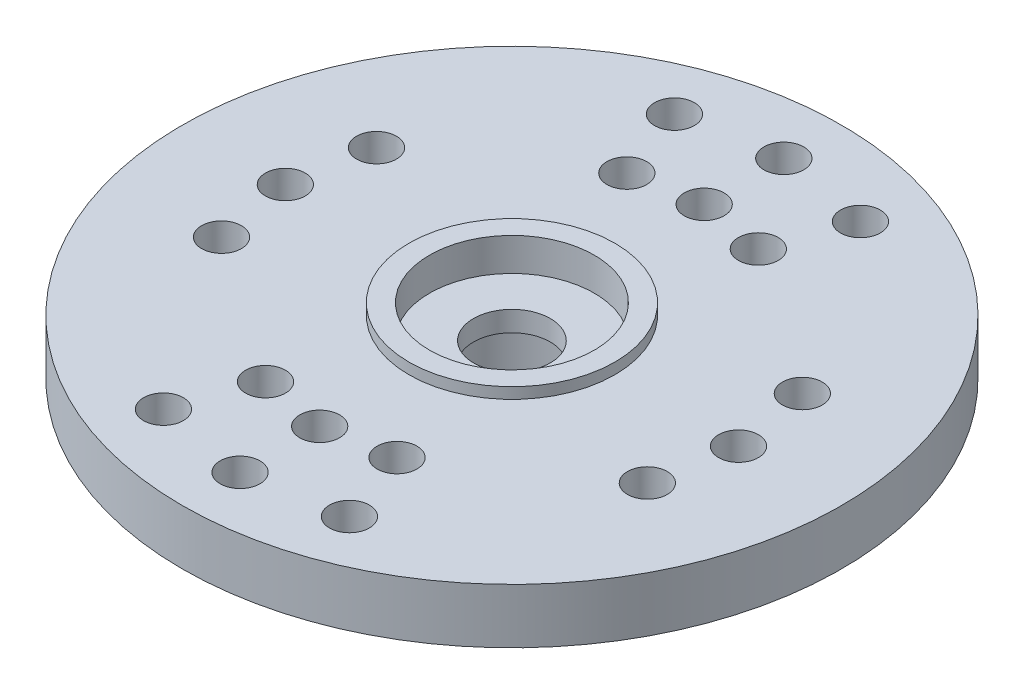
ISO-10303-21;
HEADER;
FILE_DESCRIPTION(('STEP AP214'),'2;1');
FILE_NAME('part.step','',(''),(''),'','','');
FILE_SCHEMA(('AUTOMOTIVE_DESIGN { 1 0 10303 214 1 1 1 1 }'));
ENDSEC;
DATA;
#1=APPLICATION_CONTEXT('core data for automotive mechanical design processes');
#2=APPLICATION_PROTOCOL_DEFINITION('international standard','automotive_design',2000,#1);
#3=PRODUCT_CONTEXT('',#1,'mechanical');
#4=PRODUCT('Part','Part','',(#3));
#5=PRODUCT_RELATED_PRODUCT_CATEGORY('part','',(#4));
#6=PRODUCT_DEFINITION_FORMATION('','',#4);
#7=PRODUCT_DEFINITION_CONTEXT('part definition',#1,'design');
#8=PRODUCT_DEFINITION('design','',#6,#7);
#9=PRODUCT_DEFINITION_SHAPE('','',#8);
#10=(LENGTH_UNIT() NAMED_UNIT(*) SI_UNIT(.MILLI.,.METRE.));
#11=(NAMED_UNIT(*) PLANE_ANGLE_UNIT() SI_UNIT($,.RADIAN.));
#12=(NAMED_UNIT(*) SI_UNIT($,.STERADIAN.) SOLID_ANGLE_UNIT());
#13=UNCERTAINTY_MEASURE_WITH_UNIT(LENGTH_MEASURE(1.E-05),#10,'distance_accuracy_value','');
#14=(GEOMETRIC_REPRESENTATION_CONTEXT(3) GLOBAL_UNCERTAINTY_ASSIGNED_CONTEXT((#13)) GLOBAL_UNIT_ASSIGNED_CONTEXT((#10,
#11,#12)) REPRESENTATION_CONTEXT('',''));
#15=CARTESIAN_POINT('',(0.,0.,0.));
#16=DIRECTION('',(0.,0.,1.));
#17=DIRECTION('',(1.,0.,0.));
#18=AXIS2_PLACEMENT_3D('',#15,#16,#17);
#19=CARTESIAN_POINT('',(0.,0.,0.));
#20=DIRECTION('',(0.,1.,0.));
#21=DIRECTION('',(0.,0.,1.));
#22=AXIS2_PLACEMENT_3D('',#19,#20,#21);
#23=CYLINDRICAL_SURFACE('',#22,3.75);
#24=CARTESIAN_POINT('',(0.,0.,0.));
#25=DIRECTION('',(0.,1.,0.));
#26=DIRECTION('',(0.,0.,1.));
#27=AXIS2_PLACEMENT_3D('',#24,#25,#26);
#28=CIRCLE('',#27,3.75);
#29=CARTESIAN_POINT('',(0.,0.,3.75));
#30=VERTEX_POINT('',#29);
#31=EDGE_CURVE('E88',#30,#30,#28,.T.);
#32=ORIENTED_EDGE('',*,*,#31,.T.);
#33=EDGE_LOOP('',(#32));
#34=FACE_BOUND('',#33,.T.);
#35=CARTESIAN_POINT('',(0.,0.4,0.));
#36=DIRECTION('',(0.,1.,0.));
#37=DIRECTION('',(0.,0.,1.));
#38=AXIS2_PLACEMENT_3D('',#35,#36,#37);
#39=CIRCLE('',#38,3.75);
#40=CARTESIAN_POINT('',(0.,0.4,3.75));
#41=VERTEX_POINT('',#40);
#42=EDGE_CURVE('E10',#41,#41,#39,.T.);
#43=ORIENTED_EDGE('',*,*,#42,.F.);
#44=EDGE_LOOP('',(#43));
#45=FACE_BOUND('',#44,.T.);
#46=ADVANCED_FACE('F37',(#34,#45),#23,.T.);
#47=CARTESIAN_POINT('',(-3.75,0.4,0.));
#48=DIRECTION('',(0.,1.,0.));
#49=DIRECTION('',(0.,0.,1.));
#50=AXIS2_PLACEMENT_3D('',#47,#48,#49);
#51=PLANE('',#50);
#52=ORIENTED_EDGE('',*,*,#42,.T.);
#53=EDGE_LOOP('',(#52));
#54=FACE_BOUND('',#53,.T.);
#55=CARTESIAN_POINT('',(0.,0.4,0.));
#56=DIRECTION('',(0.,1.,0.));
#57=DIRECTION('',(0.,0.,1.));
#58=AXIS2_PLACEMENT_3D('',#55,#56,#57);
#59=CIRCLE('',#58,3.);
#60=CARTESIAN_POINT('',(0.,0.4,3.));
#61=VERTEX_POINT('',#60);
#62=EDGE_CURVE('E44',#61,#61,#59,.T.);
#63=ORIENTED_EDGE('',*,*,#62,.F.);
#64=EDGE_LOOP('',(#63));
#65=FACE_BOUND('',#64,.T.);
#66=ADVANCED_FACE('F254',(#54,#65),#51,.T.);
#67=CARTESIAN_POINT('',(0.,0.,0.));
#68=DIRECTION('',(0.,1.,0.));
#69=DIRECTION('',(0.,0.,1.));
#70=AXIS2_PLACEMENT_3D('',#67,#68,#69);
#71=CYLINDRICAL_SURFACE('',#70,3.);
#72=ORIENTED_EDGE('',*,*,#62,.T.);
#73=EDGE_LOOP('',(#72));
#74=FACE_BOUND('',#73,.T.);
#75=CARTESIAN_POINT('',(0.,-0.8,0.));
#76=DIRECTION('',(0.,1.,0.));
#77=DIRECTION('',(0.,0.,1.));
#78=AXIS2_PLACEMENT_3D('',#75,#76,#77);
#79=CIRCLE('',#78,3.);
#80=CARTESIAN_POINT('',(0.,-0.8,3.));
#81=VERTEX_POINT('',#80);
#82=EDGE_CURVE('E49',#81,#81,#79,.T.);
#83=ORIENTED_EDGE('',*,*,#82,.F.);
#84=EDGE_LOOP('',(#83));
#85=FACE_BOUND('',#84,.T.);
#86=ADVANCED_FACE('F258',(#74,#85),#71,.F.);
#87=CARTESIAN_POINT('',(-3.,-0.8,0.));
#88=DIRECTION('',(0.,1.,0.));
#89=DIRECTION('',(0.,0.,1.));
#90=AXIS2_PLACEMENT_3D('',#87,#88,#89);
#91=PLANE('',#90);
#92=ORIENTED_EDGE('',*,*,#82,.T.);
#93=EDGE_LOOP('',(#92));
#94=FACE_BOUND('',#93,.T.);
#95=CARTESIAN_POINT('',(0.,-0.8,0.));
#96=DIRECTION('',(0.,1.,0.));
#97=DIRECTION('',(0.,0.,1.));
#98=AXIS2_PLACEMENT_3D('',#95,#96,#97);
#99=CIRCLE('',#98,1.4);
#100=CARTESIAN_POINT('',(0.,-0.8,1.4));
#101=VERTEX_POINT('',#100);
#102=EDGE_CURVE('E54',#101,#101,#99,.T.);
#103=ORIENTED_EDGE('',*,*,#102,.F.);
#104=EDGE_LOOP('',(#103));
#105=FACE_BOUND('',#104,.T.);
#106=ADVANCED_FACE('F262',(#94,#105),#91,.T.);
#107=CARTESIAN_POINT('',(0.,0.,0.));
#108=DIRECTION('',(0.,1.,0.));
#109=DIRECTION('',(0.,0.,1.));
#110=AXIS2_PLACEMENT_3D('',#107,#108,#109);
#111=CYLINDRICAL_SURFACE('',#110,1.4);
#112=ORIENTED_EDGE('',*,*,#102,.T.);
#113=EDGE_LOOP('',(#112));
#114=FACE_BOUND('',#113,.T.);
#115=CARTESIAN_POINT('',(0.,-1.54,0.));
#116=DIRECTION('',(0.,1.,0.));
#117=DIRECTION('',(0.,0.,1.));
#118=AXIS2_PLACEMENT_3D('',#115,#116,#117);
#119=CIRCLE('',#118,1.4);
#120=CARTESIAN_POINT('',(0.,-1.54,1.4));
#121=VERTEX_POINT('',#120);
#122=EDGE_CURVE('E60',#121,#121,#119,.T.);
#123=ORIENTED_EDGE('',*,*,#122,.F.);
#124=EDGE_LOOP('',(#123));
#125=FACE_BOUND('',#124,.T.);
#126=ADVANCED_FACE('F268',(#114,#125),#111,.F.);
#127=CARTESIAN_POINT('',(-1.4,-1.54,0.));
#128=DIRECTION('',(0.,-1.,0.));
#129=DIRECTION('',(0.,0.,-1.));
#130=AXIS2_PLACEMENT_3D('',#127,#128,#129);
#131=PLANE('',#130);
#132=ORIENTED_EDGE('',*,*,#122,.T.);
#133=EDGE_LOOP('',(#132));
#134=FACE_BOUND('',#133,.T.);
#135=CARTESIAN_POINT('',(0.,-1.54,0.));
#136=DIRECTION('',(0.,1.,0.));
#137=DIRECTION('',(0.,0.,1.));
#138=AXIS2_PLACEMENT_3D('',#135,#136,#137);
#139=CIRCLE('',#138,2.65);
#140=CARTESIAN_POINT('',(0.,-1.54,2.65));
#141=VERTEX_POINT('',#140);
#142=EDGE_CURVE('E64',#141,#141,#139,.T.);
#143=ORIENTED_EDGE('',*,*,#142,.F.);
#144=EDGE_LOOP('',(#143));
#145=FACE_BOUND('',#144,.T.);
#146=ADVANCED_FACE('F272',(#134,#145),#131,.T.);
#147=CARTESIAN_POINT('',(0.,0.,0.));
#148=DIRECTION('',(0.,1.,0.));
#149=DIRECTION('',(0.,0.,1.));
#150=AXIS2_PLACEMENT_3D('',#147,#148,#149);
#151=CYLINDRICAL_SURFACE('',#150,2.65);
#152=ORIENTED_EDGE('',*,*,#142,.T.);
#153=EDGE_LOOP('',(#152));
#154=FACE_BOUND('',#153,.T.);
#155=CARTESIAN_POINT('',(0.,-4.54,0.));
#156=DIRECTION('',(0.,1.,0.));
#157=DIRECTION('',(0.,0.,1.));
#158=AXIS2_PLACEMENT_3D('',#155,#156,#157);
#159=CIRCLE('',#158,2.65);
#160=CARTESIAN_POINT('',(0.,-4.54,2.65));
#161=VERTEX_POINT('',#160);
#162=EDGE_CURVE('E68',#161,#161,#159,.T.);
#163=ORIENTED_EDGE('',*,*,#162,.F.);
#164=EDGE_LOOP('',(#163));
#165=FACE_BOUND('',#164,.T.);
#166=ADVANCED_FACE('F276',(#154,#165),#151,.F.);
#167=CARTESIAN_POINT('',(-2.65,-4.54,0.));
#168=DIRECTION('',(0.,-1.,0.));
#169=DIRECTION('',(0.,0.,-1.));
#170=AXIS2_PLACEMENT_3D('',#167,#168,#169);
#171=PLANE('',#170);
#172=ORIENTED_EDGE('',*,*,#162,.T.);
#173=EDGE_LOOP('',(#172));
#174=FACE_BOUND('',#173,.T.);
#175=CARTESIAN_POINT('',(0.,-4.54,0.));
#176=DIRECTION('',(0.,1.,0.));
#177=DIRECTION('',(0.,0.,1.));
#178=AXIS2_PLACEMENT_3D('',#175,#176,#177);
#179=CIRCLE('',#178,4.44);
#180=CARTESIAN_POINT('',(0.,-4.54,4.44));
#181=VERTEX_POINT('',#180);
#182=EDGE_CURVE('E72',#181,#181,#179,.T.);
#183=ORIENTED_EDGE('',*,*,#182,.F.);
#184=EDGE_LOOP('',(#183));
#185=FACE_BOUND('',#184,.T.);
#186=ADVANCED_FACE('F280',(#174,#185),#171,.T.);
#187=CARTESIAN_POINT('',(0.,0.,0.));
#188=DIRECTION('',(0.,1.,0.));
#189=DIRECTION('',(0.,0.,1.));
#190=AXIS2_PLACEMENT_3D('',#187,#188,#189);
#191=CYLINDRICAL_SURFACE('',#190,4.44);
#192=ORIENTED_EDGE('',*,*,#182,.T.);
#193=EDGE_LOOP('',(#192));
#194=FACE_BOUND('',#193,.T.);
#195=CARTESIAN_POINT('',(0.,-2.,0.));
#196=DIRECTION('',(0.,1.,0.));
#197=DIRECTION('',(0.,0.,1.));
#198=AXIS2_PLACEMENT_3D('',#195,#196,#197);
#199=CIRCLE('',#198,4.44);
#200=CARTESIAN_POINT('',(0.,-2.,4.44));
#201=VERTEX_POINT('',#200);
#202=EDGE_CURVE('E76',#201,#201,#199,.T.);
#203=ORIENTED_EDGE('',*,*,#202,.F.);
#204=EDGE_LOOP('',(#203));
#205=FACE_BOUND('',#204,.T.);
#206=ADVANCED_FACE('F284',(#194,#205),#191,.T.);
#207=CARTESIAN_POINT('',(-4.44,-2.,0.));
#208=DIRECTION('',(0.,-1.,0.));
#209=DIRECTION('',(0.,0.,-1.));
#210=AXIS2_PLACEMENT_3D('',#207,#208,#209);
#211=PLANE('',#210);
#212=CARTESIAN_POINT('',(0.,-2.,9.9));
#213=DIRECTION('',(0.,-1.,0.));
#214=DIRECTION('',(0.,0.,-1.));
#215=AXIS2_PLACEMENT_3D('',#212,#213,#214);
#216=CIRCLE('',#215,0.725);
#217=CARTESIAN_POINT('',(0.,-2.,9.175));
#218=VERTEX_POINT('',#217);
#219=EDGE_CURVE('E92',#218,#218,#216,.T.);
#220=ORIENTED_EDGE('',*,*,#219,.F.);
#221=EDGE_LOOP('',(#220));
#222=FACE_BOUND('',#221,.T.);
#223=CARTESIAN_POINT('',(7.75246412148376,-2.,2.82166618243672));
#224=DIRECTION('',(0.,-1.,0.));
#225=DIRECTION('',(0.,0.,-1.));
#226=AXIS2_PLACEMENT_3D('',#223,#224,#225);
#227=CIRCLE('',#226,0.725000000000001);
#228=CARTESIAN_POINT('',(7.75246412148376,-2.,2.09666618243672));
#229=VERTEX_POINT('',#228);
#230=EDGE_CURVE('E96',#229,#229,#227,.T.);
#231=ORIENTED_EDGE('',*,*,#230,.F.);
#232=EDGE_LOOP('',(#231));
#233=FACE_BOUND('',#232,.T.);
#234=CARTESIAN_POINT('',(0.,-2.,7.));
#235=DIRECTION('',(0.,-1.,0.));
#236=DIRECTION('',(0.,0.,-1.));
#237=AXIS2_PLACEMENT_3D('',#234,#235,#236);
#238=CIRCLE('',#237,0.725);
#239=CARTESIAN_POINT('',(0.,-2.,6.275));
#240=VERTEX_POINT('',#239);
#241=EDGE_CURVE('E100',#240,#240,#238,.T.);
#242=ORIENTED_EDGE('',*,*,#241,.F.);
#243=EDGE_LOOP('',(#242));
#244=FACE_BOUND('',#243,.T.);
#245=CARTESIAN_POINT('',(8.25,-2.,0.));
#246=DIRECTION('',(0.,-1.,0.));
#247=DIRECTION('',(0.,0.,-1.));
#248=AXIS2_PLACEMENT_3D('',#245,#246,#247);
#249=CIRCLE('',#248,0.725);
#250=CARTESIAN_POINT('',(8.25,-2.,-0.725));
#251=VERTEX_POINT('',#250);
#252=EDGE_CURVE('E104',#251,#251,#249,.T.);
#253=ORIENTED_EDGE('',*,*,#252,.F.);
#254=EDGE_LOOP('',(#253));
#255=FACE_BOUND('',#254,.T.);
#256=CARTESIAN_POINT('',(-2.39414100327969,-2.,6.57784834550135));
#257=DIRECTION('',(0.,-1.,0.));
#258=DIRECTION('',(0.,0.,-1.));
#259=AXIS2_PLACEMENT_3D('',#256,#257,#258);
#260=CIRCLE('',#259,0.725);
#261=CARTESIAN_POINT('',(-2.39414100327969,-2.,5.85284834550135));
#262=VERTEX_POINT('',#261);
#263=EDGE_CURVE('E108',#262,#262,#260,.T.);
#264=ORIENTED_EDGE('',*,*,#263,.F.);
#265=EDGE_LOOP('',(#264));
#266=FACE_BOUND('',#265,.T.);
#267=CARTESIAN_POINT('',(-3.38599941892414,-2.,9.30295694578049));
#268=DIRECTION('',(0.,-1.,0.));
#269=DIRECTION('',(0.,0.,-1.));
#270=AXIS2_PLACEMENT_3D('',#267,#268,#269);
#271=CIRCLE('',#270,0.725);
#272=CARTESIAN_POINT('',(-3.38599941892414,-2.,8.57795694578049));
#273=VERTEX_POINT('',#272);
#274=EDGE_CURVE('E112',#273,#273,#271,.T.);
#275=ORIENTED_EDGE('',*,*,#274,.F.);
#276=EDGE_LOOP('',(#275));
#277=FACE_BOUND('',#276,.T.);
#278=CARTESIAN_POINT('',(2.39414100327968,-2.,6.57784834550136));
#279=DIRECTION('',(0.,-1.,0.));
#280=DIRECTION('',(0.,0.,-1.));
#281=AXIS2_PLACEMENT_3D('',#278,#279,#280);
#282=CIRCLE('',#281,0.725);
#283=CARTESIAN_POINT('',(2.39414100327968,-2.,5.85284834550136));
#284=VERTEX_POINT('',#283);
#285=EDGE_CURVE('E116',#284,#284,#282,.T.);
#286=ORIENTED_EDGE('',*,*,#285,.F.);
#287=EDGE_LOOP('',(#286));
#288=FACE_BOUND('',#287,.T.);
#289=CARTESIAN_POINT('',(3.38599941892412,-2.,9.3029569457805));
#290=DIRECTION('',(0.,-1.,0.));
#291=DIRECTION('',(0.,0.,-1.));
#292=AXIS2_PLACEMENT_3D('',#289,#290,#291);
#293=CIRCLE('',#292,0.724999999999999);
#294=CARTESIAN_POINT('',(3.38599941892412,-2.,8.5779569457805));
#295=VERTEX_POINT('',#294);
#296=EDGE_CURVE('E120',#295,#295,#293,.T.);
#297=ORIENTED_EDGE('',*,*,#296,.F.);
#298=EDGE_LOOP('',(#297));
#299=FACE_BOUND('',#298,.T.);
#300=CARTESIAN_POINT('',(2.39414100327969,-2.,-6.57784834550136));
#301=DIRECTION('',(0.,-1.,0.));
#302=DIRECTION('',(0.,0.,-1.));
#303=AXIS2_PLACEMENT_3D('',#300,#301,#302);
#304=CIRCLE('',#303,0.725);
#305=CARTESIAN_POINT('',(2.39414100327969,-2.,-7.30284834550136));
#306=VERTEX_POINT('',#305);
#307=EDGE_CURVE('E124',#306,#306,#304,.T.);
#308=ORIENTED_EDGE('',*,*,#307,.F.);
#309=EDGE_LOOP('',(#308));
#310=FACE_BOUND('',#309,.T.);
#311=CARTESIAN_POINT('',(0.,-2.,-9.9));
#312=DIRECTION('',(0.,-1.,0.));
#313=DIRECTION('',(0.,0.,-1.));
#314=AXIS2_PLACEMENT_3D('',#311,#312,#313);
#315=CIRCLE('',#314,0.725);
#316=CARTESIAN_POINT('',(0.,-2.,-10.625));
#317=VERTEX_POINT('',#316);
#318=EDGE_CURVE('E128',#317,#317,#315,.T.);
#319=ORIENTED_EDGE('',*,*,#318,.F.);
#320=EDGE_LOOP('',(#319));
#321=FACE_BOUND('',#320,.T.);
#322=CARTESIAN_POINT('',(-7.75246412148376,-2.,-2.82166618243672));
#323=DIRECTION('',(0.,-1.,0.));
#324=DIRECTION('',(0.,0.,-1.));
#325=AXIS2_PLACEMENT_3D('',#322,#323,#324);
#326=CIRCLE('',#325,0.725);
#327=CARTESIAN_POINT('',(-7.75246412148376,-2.,-3.54666618243672));
#328=VERTEX_POINT('',#327);
#329=EDGE_CURVE('E132',#328,#328,#326,.T.);
#330=ORIENTED_EDGE('',*,*,#329,.F.);
#331=EDGE_LOOP('',(#330));
#332=FACE_BOUND('',#331,.T.);
#333=CARTESIAN_POINT('',(0.,-2.,-7.));
#334=DIRECTION('',(0.,-1.,0.));
#335=DIRECTION('',(0.,0.,-1.));
#336=AXIS2_PLACEMENT_3D('',#333,#334,#335);
#337=CIRCLE('',#336,0.725);
#338=CARTESIAN_POINT('',(0.,-2.,-7.725));
#339=VERTEX_POINT('',#338);
#340=EDGE_CURVE('E136',#339,#339,#337,.T.);
#341=ORIENTED_EDGE('',*,*,#340,.F.);
#342=EDGE_LOOP('',(#341));
#343=FACE_BOUND('',#342,.T.);
#344=CARTESIAN_POINT('',(-7.75246412148376,-2.,2.82166618243672));
#345=DIRECTION('',(0.,-1.,0.));
#346=DIRECTION('',(0.,0.,-1.));
#347=AXIS2_PLACEMENT_3D('',#344,#345,#346);
#348=CIRCLE('',#347,0.725);
#349=CARTESIAN_POINT('',(-7.75246412148376,-2.,2.09666618243672));
#350=VERTEX_POINT('',#349);
#351=EDGE_CURVE('E140',#350,#350,#348,.T.);
#352=ORIENTED_EDGE('',*,*,#351,.F.);
#353=EDGE_LOOP('',(#352));
#354=FACE_BOUND('',#353,.T.);
#355=CARTESIAN_POINT('',(-3.38599941892413,-2.,-9.30295694578049));
#356=DIRECTION('',(0.,-1.,0.));
#357=DIRECTION('',(0.,0.,-1.));
#358=AXIS2_PLACEMENT_3D('',#355,#356,#357);
#359=CIRCLE('',#358,0.725);
#360=CARTESIAN_POINT('',(-3.38599941892413,-2.,-10.0279569457805));
#361=VERTEX_POINT('',#360);
#362=EDGE_CURVE('E144',#361,#361,#359,.T.);
#363=ORIENTED_EDGE('',*,*,#362,.F.);
#364=EDGE_LOOP('',(#363));
#365=FACE_BOUND('',#364,.T.);
#366=CARTESIAN_POINT('',(-2.39414100327969,-2.,-6.57784834550136));
#367=DIRECTION('',(0.,-1.,0.));
#368=DIRECTION('',(0.,0.,-1.));
#369=AXIS2_PLACEMENT_3D('',#366,#367,#368);
#370=CIRCLE('',#369,0.725);
#371=CARTESIAN_POINT('',(-2.39414100327969,-2.,-7.30284834550136));
#372=VERTEX_POINT('',#371);
#373=EDGE_CURVE('E148',#372,#372,#370,.T.);
#374=ORIENTED_EDGE('',*,*,#373,.F.);
#375=EDGE_LOOP('',(#374));
#376=FACE_BOUND('',#375,.T.);
#377=CARTESIAN_POINT('',(3.38599941892413,-2.,-9.30295694578049));
#378=DIRECTION('',(0.,-1.,0.));
#379=DIRECTION('',(0.,0.,-1.));
#380=AXIS2_PLACEMENT_3D('',#377,#378,#379);
#381=CIRCLE('',#380,0.725);
#382=CARTESIAN_POINT('',(3.38599941892413,-2.,-10.0279569457805));
#383=VERTEX_POINT('',#382);
#384=EDGE_CURVE('E152',#383,#383,#381,.T.);
#385=ORIENTED_EDGE('',*,*,#384,.F.);
#386=EDGE_LOOP('',(#385));
#387=FACE_BOUND('',#386,.T.);
#388=CARTESIAN_POINT('',(7.75246412148376,-2.,-2.82166618243672));
#389=DIRECTION('',(0.,-1.,0.));
#390=DIRECTION('',(0.,0.,-1.));
#391=AXIS2_PLACEMENT_3D('',#388,#389,#390);
#392=CIRCLE('',#391,0.725000000000001);
#393=CARTESIAN_POINT('',(7.75246412148376,-2.,-3.54666618243672));
#394=VERTEX_POINT('',#393);
#395=EDGE_CURVE('E156',#394,#394,#392,.T.);
#396=ORIENTED_EDGE('',*,*,#395,.F.);
#397=EDGE_LOOP('',(#396));
#398=FACE_BOUND('',#397,.T.);
#399=CARTESIAN_POINT('',(-8.25,-2.,0.));
#400=DIRECTION('',(0.,-1.,0.));
#401=DIRECTION('',(0.,0.,-1.));
#402=AXIS2_PLACEMENT_3D('',#399,#400,#401);
#403=CIRCLE('',#402,0.725);
#404=CARTESIAN_POINT('',(-8.25,-2.,-0.725));
#405=VERTEX_POINT('',#404);
#406=EDGE_CURVE('E160',#405,#405,#403,.T.);
#407=ORIENTED_EDGE('',*,*,#406,.F.);
#408=EDGE_LOOP('',(#407));
#409=FACE_BOUND('',#408,.T.);
#410=ORIENTED_EDGE('',*,*,#202,.T.);
#411=EDGE_LOOP('',(#410));
#412=FACE_BOUND('',#411,.T.);
#413=CARTESIAN_POINT('',(0.,-2.,0.));
#414=DIRECTION('',(0.,1.,0.));
#415=DIRECTION('',(0.,0.,1.));
#416=AXIS2_PLACEMENT_3D('',#413,#414,#415);
#417=CIRCLE('',#416,12.);
#418=CARTESIAN_POINT('',(0.,-2.,12.));
#419=VERTEX_POINT('',#418);
#420=EDGE_CURVE('E80',#419,#419,#417,.T.);
#421=ORIENTED_EDGE('',*,*,#420,.F.);
#422=EDGE_LOOP('',(#421));
#423=FACE_BOUND('',#422,.T.);
#424=ADVANCED_FACE('F288',(#222,#233,#244,#255,#266,#277,#288,#299,#310,#321,#332,#343,#354,
#365,#376,#387,#398,#409,#412,#423),#211,.T.);
#425=CARTESIAN_POINT('',(0.,0.,0.));
#426=DIRECTION('',(0.,1.,0.));
#427=DIRECTION('',(0.,0.,1.));
#428=AXIS2_PLACEMENT_3D('',#425,#426,#427);
#429=CYLINDRICAL_SURFACE('',#428,12.);
#430=ORIENTED_EDGE('',*,*,#420,.T.);
#431=EDGE_LOOP('',(#430));
#432=FACE_BOUND('',#431,.T.);
#433=CARTESIAN_POINT('',(0.,0.,0.));
#434=DIRECTION('',(0.,1.,0.));
#435=DIRECTION('',(0.,0.,1.));
#436=AXIS2_PLACEMENT_3D('',#433,#434,#435);
#437=CIRCLE('',#436,12.);
#438=CARTESIAN_POINT('',(0.,0.,12.));
#439=VERTEX_POINT('',#438);
#440=EDGE_CURVE('E84',#439,#439,#437,.T.);
#441=ORIENTED_EDGE('',*,*,#440,.F.);
#442=EDGE_LOOP('',(#441));
#443=FACE_BOUND('',#442,.T.);
#444=ADVANCED_FACE('F243',(#432,#443),#429,.T.);
#445=CARTESIAN_POINT('',(-3.75,0.,0.));
#446=DIRECTION('',(0.,1.,0.));
#447=DIRECTION('',(0.,0.,1.));
#448=AXIS2_PLACEMENT_3D('',#445,#446,#447);
#449=PLANE('',#448);
#450=CARTESIAN_POINT('',(0.,0.,9.9));
#451=DIRECTION('',(0.,1.,0.));
#452=DIRECTION('',(0.,0.,1.));
#453=AXIS2_PLACEMENT_3D('',#450,#451,#452);
#454=CIRCLE('',#453,0.725);
#455=CARTESIAN_POINT('',(0.,0.,10.625));
#456=VERTEX_POINT('',#455);
#457=EDGE_CURVE('E209',#456,#456,#454,.T.);
#458=ORIENTED_EDGE('',*,*,#457,.F.);
#459=EDGE_LOOP('',(#458));
#460=FACE_BOUND('',#459,.T.);
#461=CARTESIAN_POINT('',(7.75246412148376,0.,2.82166618243672));
#462=DIRECTION('',(0.,1.,0.));
#463=DIRECTION('',(0.,0.,1.));
#464=AXIS2_PLACEMENT_3D('',#461,#462,#463);
#465=CIRCLE('',#464,0.725000000000001);
#466=CARTESIAN_POINT('',(7.75246412148376,0.,3.54666618243672));
#467=VERTEX_POINT('',#466);
#468=EDGE_CURVE('E205',#467,#467,#465,.T.);
#469=ORIENTED_EDGE('',*,*,#468,.F.);
#470=EDGE_LOOP('',(#469));
#471=FACE_BOUND('',#470,.T.);
#472=CARTESIAN_POINT('',(0.,0.,7.));
#473=DIRECTION('',(0.,1.,0.));
#474=DIRECTION('',(0.,0.,1.));
#475=AXIS2_PLACEMENT_3D('',#472,#473,#474);
#476=CIRCLE('',#475,0.725);
#477=CARTESIAN_POINT('',(0.,0.,7.725));
#478=VERTEX_POINT('',#477);
#479=EDGE_CURVE('E201',#478,#478,#476,.T.);
#480=ORIENTED_EDGE('',*,*,#479,.F.);
#481=EDGE_LOOP('',(#480));
#482=FACE_BOUND('',#481,.T.);
#483=CARTESIAN_POINT('',(8.25,0.,0.));
#484=DIRECTION('',(0.,1.,0.));
#485=DIRECTION('',(0.,0.,1.));
#486=AXIS2_PLACEMENT_3D('',#483,#484,#485);
#487=CIRCLE('',#486,0.725);
#488=CARTESIAN_POINT('',(8.25,0.,0.725));
#489=VERTEX_POINT('',#488);
#490=EDGE_CURVE('E197',#489,#489,#487,.T.);
#491=ORIENTED_EDGE('',*,*,#490,.F.);
#492=EDGE_LOOP('',(#491));
#493=FACE_BOUND('',#492,.T.);
#494=CARTESIAN_POINT('',(-2.39414100327969,0.,6.57784834550135));
#495=DIRECTION('',(0.,1.,0.));
#496=DIRECTION('',(0.,0.,1.));
#497=AXIS2_PLACEMENT_3D('',#494,#495,#496);
#498=CIRCLE('',#497,0.725);
#499=CARTESIAN_POINT('',(-2.39414100327969,0.,7.30284834550135));
#500=VERTEX_POINT('',#499);
#501=EDGE_CURVE('E213',#500,#500,#498,.T.);
#502=ORIENTED_EDGE('',*,*,#501,.F.);
#503=EDGE_LOOP('',(#502));
#504=FACE_BOUND('',#503,.T.);
#505=CARTESIAN_POINT('',(-3.38599941892414,0.,9.30295694578049));
#506=DIRECTION('',(0.,1.,0.));
#507=DIRECTION('',(0.,0.,1.));
#508=AXIS2_PLACEMENT_3D('',#505,#506,#507);
#509=CIRCLE('',#508,0.725);
#510=CARTESIAN_POINT('',(-3.38599941892414,0.,10.0279569457805));
#511=VERTEX_POINT('',#510);
#512=EDGE_CURVE('E226',#511,#511,#509,.T.);
#513=ORIENTED_EDGE('',*,*,#512,.F.);
#514=EDGE_LOOP('',(#513));
#515=FACE_BOUND('',#514,.T.);
#516=CARTESIAN_POINT('',(2.39414100327968,0.,6.57784834550136));
#517=DIRECTION('',(0.,1.,0.));
#518=DIRECTION('',(0.,0.,-1.));
#519=AXIS2_PLACEMENT_3D('',#516,#517,#518);
#520=CIRCLE('',#519,0.725);
#521=CARTESIAN_POINT('',(2.39414100327968,0.,5.85284834550136));
#522=VERTEX_POINT('',#521);
#523=EDGE_CURVE('E221',#522,#522,#520,.T.);
#524=ORIENTED_EDGE('',*,*,#523,.F.);
#525=EDGE_LOOP('',(#524));
#526=FACE_BOUND('',#525,.T.);
#527=CARTESIAN_POINT('',(3.38599941892412,0.,9.3029569457805));
#528=DIRECTION('',(0.,1.,0.));
#529=DIRECTION('',(0.,0.,-1.));
#530=AXIS2_PLACEMENT_3D('',#527,#528,#529);
#531=CIRCLE('',#530,0.724999999999999);
#532=CARTESIAN_POINT('',(3.38599941892412,0.,8.5779569457805));
#533=VERTEX_POINT('',#532);
#534=EDGE_CURVE('E217',#533,#533,#531,.T.);
#535=ORIENTED_EDGE('',*,*,#534,.F.);
#536=EDGE_LOOP('',(#535));
#537=FACE_BOUND('',#536,.T.);
#538=CARTESIAN_POINT('',(2.39414100327969,0.,-6.57784834550136));
#539=DIRECTION('',(0.,1.,0.));
#540=DIRECTION('',(0.,0.,1.));
#541=AXIS2_PLACEMENT_3D('',#538,#539,#540);
#542=CIRCLE('',#541,0.725);
#543=CARTESIAN_POINT('',(2.39414100327969,0.,-5.85284834550136));
#544=VERTEX_POINT('',#543);
#545=EDGE_CURVE('E177',#544,#544,#542,.T.);
#546=ORIENTED_EDGE('',*,*,#545,.F.);
#547=EDGE_LOOP('',(#546));
#548=FACE_BOUND('',#547,.T.);
#549=CARTESIAN_POINT('',(0.,0.,-9.9));
#550=DIRECTION('',(0.,1.,0.));
#551=DIRECTION('',(0.,0.,1.));
#552=AXIS2_PLACEMENT_3D('',#549,#550,#551);
#553=CIRCLE('',#552,0.725);
#554=CARTESIAN_POINT('',(0.,0.,-9.175));
#555=VERTEX_POINT('',#554);
#556=EDGE_CURVE('E173',#555,#555,#553,.T.);
#557=ORIENTED_EDGE('',*,*,#556,.F.);
#558=EDGE_LOOP('',(#557));
#559=FACE_BOUND('',#558,.T.);
#560=CARTESIAN_POINT('',(-7.75246412148376,0.,-2.82166618243672));
#561=DIRECTION('',(0.,1.,0.));
#562=DIRECTION('',(0.,0.,1.));
#563=AXIS2_PLACEMENT_3D('',#560,#561,#562);
#564=CIRCLE('',#563,0.725);
#565=CARTESIAN_POINT('',(-7.75246412148376,0.,-2.09666618243672));
#566=VERTEX_POINT('',#565);
#567=EDGE_CURVE('E169',#566,#566,#564,.T.);
#568=ORIENTED_EDGE('',*,*,#567,.F.);
#569=EDGE_LOOP('',(#568));
#570=FACE_BOUND('',#569,.T.);
#571=CARTESIAN_POINT('',(0.,0.,-7.));
#572=DIRECTION('',(0.,1.,0.));
#573=DIRECTION('',(0.,0.,1.));
#574=AXIS2_PLACEMENT_3D('',#571,#572,#573);
#575=CIRCLE('',#574,0.725);
#576=CARTESIAN_POINT('',(0.,0.,-6.275));
#577=VERTEX_POINT('',#576);
#578=EDGE_CURVE('E168',#577,#577,#575,.T.);
#579=ORIENTED_EDGE('',*,*,#578,.F.);
#580=EDGE_LOOP('',(#579));
#581=FACE_BOUND('',#580,.T.);
#582=CARTESIAN_POINT('',(-7.75246412148376,0.,2.82166618243672));
#583=DIRECTION('',(0.,1.,0.));
#584=DIRECTION('',(0.,0.,-1.));
#585=AXIS2_PLACEMENT_3D('',#582,#583,#584);
#586=CIRCLE('',#585,0.725);
#587=CARTESIAN_POINT('',(-7.75246412148376,0.,2.09666618243672));
#588=VERTEX_POINT('',#587);
#589=EDGE_CURVE('E193',#588,#588,#586,.T.);
#590=ORIENTED_EDGE('',*,*,#589,.F.);
#591=EDGE_LOOP('',(#590));
#592=FACE_BOUND('',#591,.T.);
#593=CARTESIAN_POINT('',(-3.38599941892413,0.,-9.30295694578049));
#594=DIRECTION('',(0.,1.,0.));
#595=DIRECTION('',(0.,0.,-1.));
#596=AXIS2_PLACEMENT_3D('',#593,#594,#595);
#597=CIRCLE('',#596,0.725);
#598=CARTESIAN_POINT('',(-3.38599941892413,0.,-10.0279569457805));
#599=VERTEX_POINT('',#598);
#600=EDGE_CURVE('E189',#599,#599,#597,.T.);
#601=ORIENTED_EDGE('',*,*,#600,.F.);
#602=EDGE_LOOP('',(#601));
#603=FACE_BOUND('',#602,.T.);
#604=CARTESIAN_POINT('',(-2.39414100327969,0.,-6.57784834550136));
#605=DIRECTION('',(0.,1.,0.));
#606=DIRECTION('',(0.,0.,-1.));
#607=AXIS2_PLACEMENT_3D('',#604,#605,#606);
#608=CIRCLE('',#607,0.725);
#609=CARTESIAN_POINT('',(-2.39414100327969,0.,-7.30284834550136));
#610=VERTEX_POINT('',#609);
#611=EDGE_CURVE('E185',#610,#610,#608,.T.);
#612=ORIENTED_EDGE('',*,*,#611,.F.);
#613=EDGE_LOOP('',(#612));
#614=FACE_BOUND('',#613,.T.);
#615=CARTESIAN_POINT('',(3.38599941892413,0.,-9.30295694578049));
#616=DIRECTION('',(0.,1.,0.));
#617=DIRECTION('',(0.,0.,1.));
#618=AXIS2_PLACEMENT_3D('',#615,#616,#617);
#619=CIRCLE('',#618,0.725);
#620=CARTESIAN_POINT('',(3.38599941892413,0.,-8.57795694578049));
#621=VERTEX_POINT('',#620);
#622=EDGE_CURVE('E181',#621,#621,#619,.T.);
#623=ORIENTED_EDGE('',*,*,#622,.F.);
#624=EDGE_LOOP('',(#623));
#625=FACE_BOUND('',#624,.T.);
#626=CARTESIAN_POINT('',(7.75246412148376,0.,-2.82166618243672));
#627=DIRECTION('',(0.,1.,0.));
#628=DIRECTION('',(0.,0.,-1.));
#629=AXIS2_PLACEMENT_3D('',#626,#627,#628);
#630=CIRCLE('',#629,0.725000000000001);
#631=CARTESIAN_POINT('',(7.75246412148376,0.,-3.54666618243672));
#632=VERTEX_POINT('',#631);
#633=EDGE_CURVE('E222',#632,#632,#630,.T.);
#634=ORIENTED_EDGE('',*,*,#633,.F.);
#635=EDGE_LOOP('',(#634));
#636=FACE_BOUND('',#635,.T.);
#637=CARTESIAN_POINT('',(-8.25,0.,0.));
#638=DIRECTION('',(0.,1.,0.));
#639=DIRECTION('',(0.,0.,1.));
#640=AXIS2_PLACEMENT_3D('',#637,#638,#639);
#641=CIRCLE('',#640,0.725);
#642=CARTESIAN_POINT('',(-8.25,0.,0.725));
#643=VERTEX_POINT('',#642);
#644=EDGE_CURVE('E164',#643,#643,#641,.T.);
#645=ORIENTED_EDGE('',*,*,#644,.F.);
#646=EDGE_LOOP('',(#645));
#647=FACE_BOUND('',#646,.T.);
#648=ORIENTED_EDGE('',*,*,#440,.T.);
#649=EDGE_LOOP('',(#648));
#650=FACE_BOUND('',#649,.T.);
#651=ORIENTED_EDGE('',*,*,#31,.F.);
#652=EDGE_LOOP('',(#651));
#653=FACE_BOUND('',#652,.T.);
#654=ADVANCED_FACE('F239',(#460,#471,#482,#493,#504,#515,#526,#537,#548,#559,#570,#581,#592,
#603,#614,#625,#636,#647,#650,#653),#449,.T.);
#655=CARTESIAN_POINT('',(-8.25,-4.54,0.));
#656=DIRECTION('',(0.,1.,0.));
#657=DIRECTION('',(0.,0.,1.));
#658=AXIS2_PLACEMENT_3D('',#655,#656,#657);
#659=CYLINDRICAL_SURFACE('',#658,0.725);
#660=ORIENTED_EDGE('',*,*,#406,.T.);
#661=EDGE_LOOP('',(#660));
#662=FACE_BOUND('',#661,.T.);
#663=ORIENTED_EDGE('',*,*,#644,.T.);
#664=EDGE_LOOP('',(#663));
#665=FACE_BOUND('',#664,.T.);
#666=ADVANCED_FACE('F242',(#662,#665),#659,.F.);
#667=CARTESIAN_POINT('',(7.75246412148376,-4.54,-2.82166618243672));
#668=DIRECTION('',(0.,1.,0.));
#669=DIRECTION('',(0.,0.,1.));
#670=AXIS2_PLACEMENT_3D('',#667,#668,#669);
#671=CYLINDRICAL_SURFACE('',#670,0.725000000000001);
#672=ORIENTED_EDGE('',*,*,#395,.T.);
#673=EDGE_LOOP('',(#672));
#674=FACE_BOUND('',#673,.T.);
#675=ORIENTED_EDGE('',*,*,#633,.T.);
#676=EDGE_LOOP('',(#675));
#677=FACE_BOUND('',#676,.T.);
#678=ADVANCED_FACE('F237',(#674,#677),#671,.F.);
#679=CARTESIAN_POINT('',(3.38599941892413,-4.54,-9.30295694578049));
#680=DIRECTION('',(0.,1.,0.));
#681=DIRECTION('',(0.,0.,1.));
#682=AXIS2_PLACEMENT_3D('',#679,#680,#681);
#683=CYLINDRICAL_SURFACE('',#682,0.725);
#684=ORIENTED_EDGE('',*,*,#384,.T.);
#685=EDGE_LOOP('',(#684));
#686=FACE_BOUND('',#685,.T.);
#687=ORIENTED_EDGE('',*,*,#622,.T.);
#688=EDGE_LOOP('',(#687));
#689=FACE_BOUND('',#688,.T.);
#690=ADVANCED_FACE('F321',(#686,#689),#683,.F.);
#691=CARTESIAN_POINT('',(-2.39414100327969,-4.54,-6.57784834550136));
#692=DIRECTION('',(0.,1.,0.));
#693=DIRECTION('',(0.,0.,1.));
#694=AXIS2_PLACEMENT_3D('',#691,#692,#693);
#695=CYLINDRICAL_SURFACE('',#694,0.725);
#696=ORIENTED_EDGE('',*,*,#373,.T.);
#697=EDGE_LOOP('',(#696));
#698=FACE_BOUND('',#697,.T.);
#699=ORIENTED_EDGE('',*,*,#611,.T.);
#700=EDGE_LOOP('',(#699));
#701=FACE_BOUND('',#700,.T.);
#702=ADVANCED_FACE('F317',(#698,#701),#695,.F.);
#703=CARTESIAN_POINT('',(-3.38599941892413,-4.54,-9.30295694578049));
#704=DIRECTION('',(0.,1.,0.));
#705=DIRECTION('',(0.,0.,1.));
#706=AXIS2_PLACEMENT_3D('',#703,#704,#705);
#707=CYLINDRICAL_SURFACE('',#706,0.725);
#708=ORIENTED_EDGE('',*,*,#362,.T.);
#709=EDGE_LOOP('',(#708));
#710=FACE_BOUND('',#709,.T.);
#711=ORIENTED_EDGE('',*,*,#600,.T.);
#712=EDGE_LOOP('',(#711));
#713=FACE_BOUND('',#712,.T.);
#714=ADVANCED_FACE('F320',(#710,#713),#707,.F.);
#715=CARTESIAN_POINT('',(-7.75246412148376,-4.54,2.82166618243672));
#716=DIRECTION('',(0.,1.,0.));
#717=DIRECTION('',(0.,0.,1.));
#718=AXIS2_PLACEMENT_3D('',#715,#716,#717);
#719=CYLINDRICAL_SURFACE('',#718,0.725);
#720=ORIENTED_EDGE('',*,*,#351,.T.);
#721=EDGE_LOOP('',(#720));
#722=FACE_BOUND('',#721,.T.);
#723=ORIENTED_EDGE('',*,*,#589,.T.);
#724=EDGE_LOOP('',(#723));
#725=FACE_BOUND('',#724,.T.);
#726=ADVANCED_FACE('F307',(#722,#725),#719,.F.);
#727=CARTESIAN_POINT('',(0.,-4.54,-7.));
#728=DIRECTION('',(0.,1.,0.));
#729=DIRECTION('',(0.,0.,1.));
#730=AXIS2_PLACEMENT_3D('',#727,#728,#729);
#731=CYLINDRICAL_SURFACE('',#730,0.725);
#732=ORIENTED_EDGE('',*,*,#340,.T.);
#733=EDGE_LOOP('',(#732));
#734=FACE_BOUND('',#733,.T.);
#735=ORIENTED_EDGE('',*,*,#578,.T.);
#736=EDGE_LOOP('',(#735));
#737=FACE_BOUND('',#736,.T.);
#738=ADVANCED_FACE('F303',(#734,#737),#731,.F.);
#739=CARTESIAN_POINT('',(-7.75246412148376,-4.54,-2.82166618243672));
#740=DIRECTION('',(0.,1.,0.));
#741=DIRECTION('',(0.,0.,1.));
#742=AXIS2_PLACEMENT_3D('',#739,#740,#741);
#743=CYLINDRICAL_SURFACE('',#742,0.725);
#744=ORIENTED_EDGE('',*,*,#329,.T.);
#745=EDGE_LOOP('',(#744));
#746=FACE_BOUND('',#745,.T.);
#747=ORIENTED_EDGE('',*,*,#567,.T.);
#748=EDGE_LOOP('',(#747));
#749=FACE_BOUND('',#748,.T.);
#750=ADVANCED_FACE('F299',(#746,#749),#743,.F.);
#751=CARTESIAN_POINT('',(0.,-4.54,-9.9));
#752=DIRECTION('',(0.,1.,0.));
#753=DIRECTION('',(0.,0.,1.));
#754=AXIS2_PLACEMENT_3D('',#751,#752,#753);
#755=CYLINDRICAL_SURFACE('',#754,0.725);
#756=ORIENTED_EDGE('',*,*,#318,.T.);
#757=EDGE_LOOP('',(#756));
#758=FACE_BOUND('',#757,.T.);
#759=ORIENTED_EDGE('',*,*,#556,.T.);
#760=EDGE_LOOP('',(#759));
#761=FACE_BOUND('',#760,.T.);
#762=ADVANCED_FACE('F302',(#758,#761),#755,.F.);
#763=CARTESIAN_POINT('',(2.39414100327969,-4.54,-6.57784834550136));
#764=DIRECTION('',(0.,1.,0.));
#765=DIRECTION('',(0.,0.,1.));
#766=AXIS2_PLACEMENT_3D('',#763,#764,#765);
#767=CYLINDRICAL_SURFACE('',#766,0.725);
#768=ORIENTED_EDGE('',*,*,#307,.T.);
#769=EDGE_LOOP('',(#768));
#770=FACE_BOUND('',#769,.T.);
#771=ORIENTED_EDGE('',*,*,#545,.T.);
#772=EDGE_LOOP('',(#771));
#773=FACE_BOUND('',#772,.T.);
#774=ADVANCED_FACE('F309',(#770,#773),#767,.F.);
#775=CARTESIAN_POINT('',(3.38599941892412,-4.54,9.3029569457805));
#776=DIRECTION('',(0.,1.,0.));
#777=DIRECTION('',(0.,0.,1.));
#778=AXIS2_PLACEMENT_3D('',#775,#776,#777);
#779=CYLINDRICAL_SURFACE('',#778,0.724999999999999);
#780=ORIENTED_EDGE('',*,*,#296,.T.);
#781=EDGE_LOOP('',(#780));
#782=FACE_BOUND('',#781,.T.);
#783=ORIENTED_EDGE('',*,*,#534,.T.);
#784=EDGE_LOOP('',(#783));
#785=FACE_BOUND('',#784,.T.);
#786=ADVANCED_FACE('F312',(#782,#785),#779,.F.);
#787=CARTESIAN_POINT('',(2.39414100327968,-4.54,6.57784834550136));
#788=DIRECTION('',(0.,1.,0.));
#789=DIRECTION('',(0.,0.,1.));
#790=AXIS2_PLACEMENT_3D('',#787,#788,#789);
#791=CYLINDRICAL_SURFACE('',#790,0.725);
#792=ORIENTED_EDGE('',*,*,#285,.T.);
#793=EDGE_LOOP('',(#792));
#794=FACE_BOUND('',#793,.T.);
#795=ORIENTED_EDGE('',*,*,#523,.T.);
#796=EDGE_LOOP('',(#795));
#797=FACE_BOUND('',#796,.T.);
#798=ADVANCED_FACE('F351',(#794,#797),#791,.F.);
#799=CARTESIAN_POINT('',(-3.38599941892414,-4.54,9.30295694578049));
#800=DIRECTION('',(0.,1.,0.));
#801=DIRECTION('',(0.,0.,1.));
#802=AXIS2_PLACEMENT_3D('',#799,#800,#801);
#803=CYLINDRICAL_SURFACE('',#802,0.725);
#804=ORIENTED_EDGE('',*,*,#274,.T.);
#805=EDGE_LOOP('',(#804));
#806=FACE_BOUND('',#805,.T.);
#807=ORIENTED_EDGE('',*,*,#512,.T.);
#808=EDGE_LOOP('',(#807));
#809=FACE_BOUND('',#808,.T.);
#810=ADVANCED_FACE('F355',(#806,#809),#803,.F.);
#811=CARTESIAN_POINT('',(-2.39414100327969,-4.54,6.57784834550135));
#812=DIRECTION('',(0.,1.,0.));
#813=DIRECTION('',(0.,0.,1.));
#814=AXIS2_PLACEMENT_3D('',#811,#812,#813);
#815=CYLINDRICAL_SURFACE('',#814,0.725);
#816=ORIENTED_EDGE('',*,*,#263,.T.);
#817=EDGE_LOOP('',(#816));
#818=FACE_BOUND('',#817,.T.);
#819=ORIENTED_EDGE('',*,*,#501,.T.);
#820=EDGE_LOOP('',(#819));
#821=FACE_BOUND('',#820,.T.);
#822=ADVANCED_FACE('F340',(#818,#821),#815,.F.);
#823=CARTESIAN_POINT('',(8.25,-4.54,0.));
#824=DIRECTION('',(0.,1.,0.));
#825=DIRECTION('',(0.,0.,1.));
#826=AXIS2_PLACEMENT_3D('',#823,#824,#825);
#827=CYLINDRICAL_SURFACE('',#826,0.725);
#828=ORIENTED_EDGE('',*,*,#252,.T.);
#829=EDGE_LOOP('',(#828));
#830=FACE_BOUND('',#829,.T.);
#831=ORIENTED_EDGE('',*,*,#490,.T.);
#832=EDGE_LOOP('',(#831));
#833=FACE_BOUND('',#832,.T.);
#834=ADVANCED_FACE('F336',(#830,#833),#827,.F.);
#835=CARTESIAN_POINT('',(0.,-4.54,7.));
#836=DIRECTION('',(0.,1.,0.));
#837=DIRECTION('',(0.,0.,1.));
#838=AXIS2_PLACEMENT_3D('',#835,#836,#837);
#839=CYLINDRICAL_SURFACE('',#838,0.725);
#840=ORIENTED_EDGE('',*,*,#241,.T.);
#841=EDGE_LOOP('',(#840));
#842=FACE_BOUND('',#841,.T.);
#843=ORIENTED_EDGE('',*,*,#479,.T.);
#844=EDGE_LOOP('',(#843));
#845=FACE_BOUND('',#844,.T.);
#846=ADVANCED_FACE('F332',(#842,#845),#839,.F.);
#847=CARTESIAN_POINT('',(7.75246412148376,-4.54,2.82166618243672));
#848=DIRECTION('',(0.,1.,0.));
#849=DIRECTION('',(0.,0.,1.));
#850=AXIS2_PLACEMENT_3D('',#847,#848,#849);
#851=CYLINDRICAL_SURFACE('',#850,0.725000000000001);
#852=ORIENTED_EDGE('',*,*,#230,.T.);
#853=EDGE_LOOP('',(#852));
#854=FACE_BOUND('',#853,.T.);
#855=ORIENTED_EDGE('',*,*,#468,.T.);
#856=EDGE_LOOP('',(#855));
#857=FACE_BOUND('',#856,.T.);
#858=ADVANCED_FACE('F335',(#854,#857),#851,.F.);
#859=CARTESIAN_POINT('',(0.,-4.54,9.9));
#860=DIRECTION('',(0.,1.,0.));
#861=DIRECTION('',(0.,0.,1.));
#862=AXIS2_PLACEMENT_3D('',#859,#860,#861);
#863=CYLINDRICAL_SURFACE('',#862,0.725);
#864=ORIENTED_EDGE('',*,*,#219,.T.);
#865=EDGE_LOOP('',(#864));
#866=FACE_BOUND('',#865,.T.);
#867=ORIENTED_EDGE('',*,*,#457,.T.);
#868=EDGE_LOOP('',(#867));
#869=FACE_BOUND('',#868,.T.);
#870=ADVANCED_FACE('F342',(#866,#869),#863,.F.);
#871=CLOSED_SHELL('',(#46,#66,#86,#106,#126,#146,#166,#186,#206,#424,#444,#654,#666,#678,#690,
#702,#714,#726,#738,#750,#762,#774,#786,#798,#810,#822,#834,#846,#858,#870));
#872=MANIFOLD_SOLID_BREP('B2',#871);
#873=ADVANCED_BREP_SHAPE_REPRESENTATION('',(#18,#872),#14);
#874=SHAPE_DEFINITION_REPRESENTATION(#9,#873);
ENDSEC;
END-ISO-10303-21;
